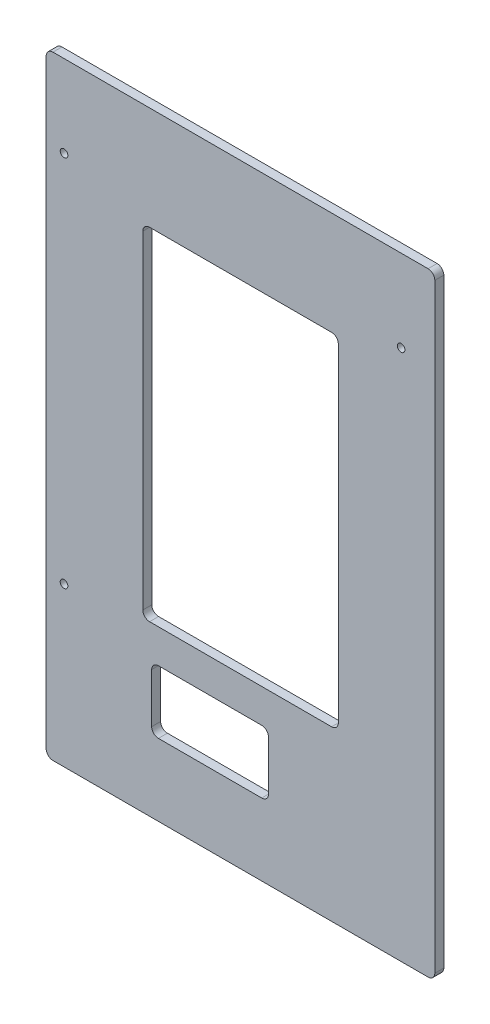
ISO-10303-21;
HEADER;
FILE_DESCRIPTION(('STEP AP214'),'2;1');
FILE_NAME('part.step','',(''),(''),'','','');
FILE_SCHEMA(('AUTOMOTIVE_DESIGN { 1 0 10303 214 1 1 1 1 }'));
ENDSEC;
DATA;
#1=APPLICATION_CONTEXT('core data for automotive mechanical design processes');
#2=APPLICATION_PROTOCOL_DEFINITION('international standard','automotive_design',2000,#1);
#3=PRODUCT_CONTEXT('',#1,'mechanical');
#4=PRODUCT('Part','Part','',(#3));
#5=PRODUCT_RELATED_PRODUCT_CATEGORY('part','',(#4));
#6=PRODUCT_DEFINITION_FORMATION('','',#4);
#7=PRODUCT_DEFINITION_CONTEXT('part definition',#1,'design');
#8=PRODUCT_DEFINITION('design','',#6,#7);
#9=PRODUCT_DEFINITION_SHAPE('','',#8);
#10=(LENGTH_UNIT() NAMED_UNIT(*) SI_UNIT(.MILLI.,.METRE.));
#11=(NAMED_UNIT(*) PLANE_ANGLE_UNIT() SI_UNIT($,.RADIAN.));
#12=(NAMED_UNIT(*) SI_UNIT($,.STERADIAN.) SOLID_ANGLE_UNIT());
#13=UNCERTAINTY_MEASURE_WITH_UNIT(LENGTH_MEASURE(1.E-05),#10,'distance_accuracy_value','');
#14=(GEOMETRIC_REPRESENTATION_CONTEXT(3) GLOBAL_UNCERTAINTY_ASSIGNED_CONTEXT((#13)) GLOBAL_UNIT_ASSIGNED_CONTEXT((#10,
#11,#12)) REPRESENTATION_CONTEXT('',''));
#15=CARTESIAN_POINT('',(0.,0.,0.));
#16=DIRECTION('',(0.,0.,1.));
#17=DIRECTION('',(1.,0.,0.));
#18=AXIS2_PLACEMENT_3D('',#15,#16,#17);
#19=CARTESIAN_POINT('',(0.,0.,4.));
#20=DIRECTION('',(0.,0.,-1.));
#21=DIRECTION('',(-1.,0.,0.));
#22=AXIS2_PLACEMENT_3D('',#19,#20,#21);
#23=PLANE('',#22);
#24=CARTESIAN_POINT('',(7.93,236.5,4.));
#25=DIRECTION('',(0.,0.,1.));
#26=DIRECTION('',(1.,0.,0.));
#27=AXIS2_PLACEMENT_3D('',#24,#25,#26);
#28=CIRCLE('',#27,1.69999999999999);
#29=CARTESIAN_POINT('',(9.62999999999999,236.5,4.));
#30=VERTEX_POINT('',#29);
#31=EDGE_CURVE('E693',#30,#30,#28,.T.);
#32=ORIENTED_EDGE('',*,*,#31,.F.);
#33=EDGE_LOOP('',(#32));
#34=FACE_BOUND('',#33,.T.);
#35=CARTESIAN_POINT('',(7.93,70.5,4.));
#36=DIRECTION('',(0.,0.,1.));
#37=DIRECTION('',(1.,0.,0.));
#38=AXIS2_PLACEMENT_3D('',#35,#36,#37);
#39=CIRCLE('',#38,1.69999999999999);
#40=CARTESIAN_POINT('',(9.62999999999999,70.5,4.));
#41=VERTEX_POINT('',#40);
#42=EDGE_CURVE('E697',#41,#41,#39,.T.);
#43=ORIENTED_EDGE('',*,*,#42,.F.);
#44=EDGE_LOOP('',(#43));
#45=FACE_BOUND('',#44,.T.);
#46=CARTESIAN_POINT('',(157.93,236.5,4.));
#47=DIRECTION('',(0.,0.,1.));
#48=DIRECTION('',(1.,0.,0.));
#49=AXIS2_PLACEMENT_3D('',#46,#47,#48);
#50=CIRCLE('',#49,1.69999999999998);
#51=CARTESIAN_POINT('',(159.63,236.5,4.));
#52=VERTEX_POINT('',#51);
#53=EDGE_CURVE('E707',#52,#52,#50,.T.);
#54=ORIENTED_EDGE('',*,*,#53,.F.);
#55=EDGE_LOOP('',(#54));
#56=FACE_BOUND('',#55,.T.);
#57=DIRECTION('',(0.,-1.,0.));
#58=VECTOR('',#57,1.);
#59=CARTESIAN_POINT('',(43.,75.,4.));
#60=LINE('',#59,#58);
#61=CARTESIAN_POINT('',(43.,224.,4.));
#62=VERTEX_POINT('',#61);
#63=CARTESIAN_POINT('',(43.,78.,4.));
#64=VERTEX_POINT('',#63);
#65=EDGE_CURVE('E405',#62,#64,#60,.T.);
#66=ORIENTED_EDGE('',*,*,#65,.F.);
#67=CARTESIAN_POINT('',(46.,224.,4.));
#68=DIRECTION('',(0.,0.,-1.));
#69=DIRECTION('',(-1.,0.,0.));
#70=AXIS2_PLACEMENT_3D('',#67,#68,#69);
#71=CIRCLE('',#70,3.);
#72=CARTESIAN_POINT('',(46.,227.,4.));
#73=VERTEX_POINT('',#72);
#74=EDGE_CURVE('E11',#62,#73,#71,.T.);
#75=ORIENTED_EDGE('',*,*,#74,.T.);
#76=DIRECTION('',(-1.,0.,0.));
#77=VECTOR('',#76,1.);
#78=CARTESIAN_POINT('',(43.,227.,4.));
#79=LINE('',#78,#77);
#80=CARTESIAN_POINT('',(127.,227.,4.));
#81=VERTEX_POINT('',#80);
#82=EDGE_CURVE('E403',#81,#73,#79,.T.);
#83=ORIENTED_EDGE('',*,*,#82,.F.);
#84=CARTESIAN_POINT('',(127.,224.,4.));
#85=DIRECTION('',(0.,0.,-1.));
#86=DIRECTION('',(-1.,0.,0.));
#87=AXIS2_PLACEMENT_3D('',#84,#85,#86);
#88=CIRCLE('',#87,3.);
#89=CARTESIAN_POINT('',(130.,224.,4.));
#90=VERTEX_POINT('',#89);
#91=EDGE_CURVE('E374',#81,#90,#88,.T.);
#92=ORIENTED_EDGE('',*,*,#91,.T.);
#93=DIRECTION('',(0.,1.,0.));
#94=VECTOR('',#93,1.);
#95=CARTESIAN_POINT('',(130.,75.,4.));
#96=LINE('',#95,#94);
#97=CARTESIAN_POINT('',(130.,78.,4.));
#98=VERTEX_POINT('',#97);
#99=EDGE_CURVE('E411',#98,#90,#96,.T.);
#100=ORIENTED_EDGE('',*,*,#99,.F.);
#101=CARTESIAN_POINT('',(127.,78.,4.));
#102=DIRECTION('',(0.,0.,-1.));
#103=DIRECTION('',(-1.,0.,0.));
#104=AXIS2_PLACEMENT_3D('',#101,#102,#103);
#105=CIRCLE('',#104,3.);
#106=CARTESIAN_POINT('',(127.,75.,4.));
#107=VERTEX_POINT('',#106);
#108=EDGE_CURVE('E368',#98,#107,#105,.T.);
#109=ORIENTED_EDGE('',*,*,#108,.T.);
#110=DIRECTION('',(1.,0.,0.));
#111=VECTOR('',#110,1.);
#112=CARTESIAN_POINT('',(43.,75.,4.));
#113=LINE('',#112,#111);
#114=CARTESIAN_POINT('',(46.,75.,4.));
#115=VERTEX_POINT('',#114);
#116=EDGE_CURVE('E419',#115,#107,#113,.T.);
#117=ORIENTED_EDGE('',*,*,#116,.F.);
#118=CARTESIAN_POINT('',(46.,78.,4.));
#119=DIRECTION('',(0.,0.,-1.));
#120=DIRECTION('',(-1.,0.,0.));
#121=AXIS2_PLACEMENT_3D('',#118,#119,#120);
#122=CIRCLE('',#121,3.);
#123=EDGE_CURVE('E362',#115,#64,#122,.T.);
#124=ORIENTED_EDGE('',*,*,#123,.T.);
#125=EDGE_LOOP('',(#66,#75,#83,#92,#100,#109,#117,#124));
#126=FACE_BOUND('',#125,.T.);
#127=DIRECTION('',(0.,-1.,0.));
#128=VECTOR('',#127,1.);
#129=CARTESIAN_POINT('',(0.,0.,4.));
#130=LINE('',#129,#128);
#131=CARTESIAN_POINT('',(0.,270.,4.));
#132=VERTEX_POINT('',#131);
#133=CARTESIAN_POINT('',(0.,3.,4.));
#134=VERTEX_POINT('',#133);
#135=EDGE_CURVE('E431',#132,#134,#130,.T.);
#136=ORIENTED_EDGE('',*,*,#135,.T.);
#137=CARTESIAN_POINT('',(3.,3.,4.));
#138=DIRECTION('',(0.,0.,-1.));
#139=DIRECTION('',(-1.,0.,0.));
#140=AXIS2_PLACEMENT_3D('',#137,#138,#139);
#141=CIRCLE('',#140,3.);
#142=CARTESIAN_POINT('',(3.,0.,4.));
#143=VERTEX_POINT('',#142);
#144=EDGE_CURVE('E324',#134,#143,#141,.F.);
#145=ORIENTED_EDGE('',*,*,#144,.T.);
#146=DIRECTION('',(1.,0.,0.));
#147=VECTOR('',#146,1.);
#148=CARTESIAN_POINT('',(0.,0.,4.));
#149=LINE('',#148,#147);
#150=CARTESIAN_POINT('',(169.93,0.,4.));
#151=VERTEX_POINT('',#150);
#152=EDGE_CURVE('E435',#143,#151,#149,.T.);
#153=ORIENTED_EDGE('',*,*,#152,.T.);
#154=CARTESIAN_POINT('',(169.93,3.,4.));
#155=DIRECTION('',(0.,0.,-1.));
#156=DIRECTION('',(-1.,0.,0.));
#157=AXIS2_PLACEMENT_3D('',#154,#155,#156);
#158=CIRCLE('',#157,3.);
#159=CARTESIAN_POINT('',(172.93,3.,4.));
#160=VERTEX_POINT('',#159);
#161=EDGE_CURVE('E321',#151,#160,#158,.F.);
#162=ORIENTED_EDGE('',*,*,#161,.T.);
#163=DIRECTION('',(0.,1.,0.));
#164=VECTOR('',#163,1.);
#165=CARTESIAN_POINT('',(172.93,0.,4.));
#166=LINE('',#165,#164);
#167=CARTESIAN_POINT('',(172.93,270.,4.));
#168=VERTEX_POINT('',#167);
#169=EDGE_CURVE('E237',#160,#168,#166,.T.);
#170=ORIENTED_EDGE('',*,*,#169,.T.);
#171=CARTESIAN_POINT('',(169.93,270.,4.));
#172=DIRECTION('',(0.,0.,-1.));
#173=DIRECTION('',(-1.,0.,0.));
#174=AXIS2_PLACEMENT_3D('',#171,#172,#173);
#175=CIRCLE('',#174,3.);
#176=CARTESIAN_POINT('',(169.93,273.,4.));
#177=VERTEX_POINT('',#176);
#178=EDGE_CURVE('E62',#168,#177,#175,.F.);
#179=ORIENTED_EDGE('',*,*,#178,.T.);
#180=DIRECTION('',(-1.,0.,0.));
#181=VECTOR('',#180,1.);
#182=CARTESIAN_POINT('',(0.,273.,4.));
#183=LINE('',#182,#181);
#184=CARTESIAN_POINT('',(3.,273.,4.));
#185=VERTEX_POINT('',#184);
#186=EDGE_CURVE('E231',#177,#185,#183,.T.);
#187=ORIENTED_EDGE('',*,*,#186,.T.);
#188=CARTESIAN_POINT('',(3.,270.,4.));
#189=DIRECTION('',(0.,0.,-1.));
#190=DIRECTION('',(-1.,0.,0.));
#191=AXIS2_PLACEMENT_3D('',#188,#189,#190);
#192=CIRCLE('',#191,3.);
#193=EDGE_CURVE('E316',#185,#132,#192,.F.);
#194=ORIENTED_EDGE('',*,*,#193,.T.);
#195=EDGE_LOOP('',(#136,#145,#153,#162,#170,#179,#187,#194));
#196=FACE_BOUND('',#195,.T.);
#197=DIRECTION('',(0.,-1.,0.));
#198=VECTOR('',#197,1.);
#199=CARTESIAN_POINT('',(46.93,60.,4.));
#200=LINE('',#199,#198);
#201=CARTESIAN_POINT('',(46.93,57.,4.));
#202=VERTEX_POINT('',#201);
#203=CARTESIAN_POINT('',(46.93,35.,4.));
#204=VERTEX_POINT('',#203);
#205=EDGE_CURVE('E715',#202,#204,#200,.T.);
#206=ORIENTED_EDGE('',*,*,#205,.F.);
#207=CARTESIAN_POINT('',(49.93,57.,4.));
#208=DIRECTION('',(0.,0.,-1.));
#209=DIRECTION('',(-1.,0.,0.));
#210=AXIS2_PLACEMENT_3D('',#207,#208,#209);
#211=CIRCLE('',#210,3.);
#212=CARTESIAN_POINT('',(49.93,60.,4.));
#213=VERTEX_POINT('',#212);
#214=EDGE_CURVE('E356',#202,#213,#211,.T.);
#215=ORIENTED_EDGE('',*,*,#214,.T.);
#216=DIRECTION('',(-1.,0.,0.));
#217=VECTOR('',#216,1.);
#218=CARTESIAN_POINT('',(46.93,60.,4.));
#219=LINE('',#218,#217);
#220=CARTESIAN_POINT('',(95.93,60.,4.));
#221=VERTEX_POINT('',#220);
#222=EDGE_CURVE('E396',#221,#213,#219,.T.);
#223=ORIENTED_EDGE('',*,*,#222,.F.);
#224=CARTESIAN_POINT('',(95.93,57.,4.));
#225=DIRECTION('',(0.,0.,-1.));
#226=DIRECTION('',(-1.,0.,0.));
#227=AXIS2_PLACEMENT_3D('',#224,#225,#226);
#228=CIRCLE('',#227,3.);
#229=CARTESIAN_POINT('',(98.93,57.,4.));
#230=VERTEX_POINT('',#229);
#231=EDGE_CURVE('E350',#221,#230,#228,.T.);
#232=ORIENTED_EDGE('',*,*,#231,.T.);
#233=DIRECTION('',(0.,1.,0.));
#234=VECTOR('',#233,1.);
#235=CARTESIAN_POINT('',(98.93,60.,4.));
#236=LINE('',#235,#234);
#237=CARTESIAN_POINT('',(98.93,35.,4.));
#238=VERTEX_POINT('',#237);
#239=EDGE_CURVE('E723',#238,#230,#236,.T.);
#240=ORIENTED_EDGE('',*,*,#239,.F.);
#241=CARTESIAN_POINT('',(95.93,35.,4.));
#242=DIRECTION('',(0.,0.,-1.));
#243=DIRECTION('',(-1.,0.,0.));
#244=AXIS2_PLACEMENT_3D('',#241,#242,#243);
#245=CIRCLE('',#244,3.);
#246=CARTESIAN_POINT('',(95.93,32.,4.));
#247=VERTEX_POINT('',#246);
#248=EDGE_CURVE('E215',#238,#247,#245,.T.);
#249=ORIENTED_EDGE('',*,*,#248,.T.);
#250=DIRECTION('',(1.,0.,0.));
#251=VECTOR('',#250,1.);
#252=CARTESIAN_POINT('',(46.93,32.,4.));
#253=LINE('',#252,#251);
#254=CARTESIAN_POINT('',(49.93,32.,4.));
#255=VERTEX_POINT('',#254);
#256=EDGE_CURVE('E719',#255,#247,#253,.T.);
#257=ORIENTED_EDGE('',*,*,#256,.F.);
#258=CARTESIAN_POINT('',(49.93,35.,4.));
#259=DIRECTION('',(0.,0.,-1.));
#260=DIRECTION('',(-1.,0.,0.));
#261=AXIS2_PLACEMENT_3D('',#258,#259,#260);
#262=CIRCLE('',#261,3.);
#263=EDGE_CURVE('E214',#255,#204,#262,.T.);
#264=ORIENTED_EDGE('',*,*,#263,.T.);
#265=EDGE_LOOP('',(#206,#215,#223,#232,#240,#249,#257,#264));
#266=FACE_BOUND('',#265,.T.);
#267=ADVANCED_FACE('F39',(#34,#45,#56,#126,#196,#266),#23,.F.);
#268=CARTESIAN_POINT('',(0.,0.,0.));
#269=DIRECTION('',(0.,0.,-1.));
#270=DIRECTION('',(-1.,0.,0.));
#271=AXIS2_PLACEMENT_3D('',#268,#269,#270);
#272=PLANE('',#271);
#273=CARTESIAN_POINT('',(7.93,236.5,0.));
#274=DIRECTION('',(0.,0.,1.));
#275=DIRECTION('',(1.,0.,0.));
#276=AXIS2_PLACEMENT_3D('',#273,#274,#275);
#277=CIRCLE('',#276,1.7);
#278=CARTESIAN_POINT('',(9.63,236.5,0.));
#279=VERTEX_POINT('',#278);
#280=EDGE_CURVE('E690',#279,#279,#277,.T.);
#281=ORIENTED_EDGE('',*,*,#280,.T.);
#282=EDGE_LOOP('',(#281));
#283=FACE_BOUND('',#282,.T.);
#284=CARTESIAN_POINT('',(7.93,70.5,0.));
#285=DIRECTION('',(0.,0.,1.));
#286=DIRECTION('',(1.,0.,0.));
#287=AXIS2_PLACEMENT_3D('',#284,#285,#286);
#288=CIRCLE('',#287,1.7);
#289=CARTESIAN_POINT('',(9.63,70.5,0.));
#290=VERTEX_POINT('',#289);
#291=EDGE_CURVE('E703',#290,#290,#288,.T.);
#292=ORIENTED_EDGE('',*,*,#291,.T.);
#293=EDGE_LOOP('',(#292));
#294=FACE_BOUND('',#293,.T.);
#295=CARTESIAN_POINT('',(157.93,236.5,0.));
#296=DIRECTION('',(0.,0.,1.));
#297=DIRECTION('',(1.,0.,0.));
#298=AXIS2_PLACEMENT_3D('',#295,#296,#297);
#299=CIRCLE('',#298,1.70000000000001);
#300=CARTESIAN_POINT('',(159.63,236.5,0.));
#301=VERTEX_POINT('',#300);
#302=EDGE_CURVE('E711',#301,#301,#299,.T.);
#303=ORIENTED_EDGE('',*,*,#302,.T.);
#304=EDGE_LOOP('',(#303));
#305=FACE_BOUND('',#304,.T.);
#306=DIRECTION('',(0.,1.,0.));
#307=VECTOR('',#306,1.);
#308=CARTESIAN_POINT('',(130.,75.,0.));
#309=LINE('',#308,#307);
#310=CARTESIAN_POINT('',(130.,78.,0.));
#311=VERTEX_POINT('',#310);
#312=CARTESIAN_POINT('',(130.,224.,0.));
#313=VERTEX_POINT('',#312);
#314=EDGE_CURVE('E426',#311,#313,#309,.T.);
#315=ORIENTED_EDGE('',*,*,#314,.T.);
#316=CARTESIAN_POINT('',(127.,224.,0.));
#317=DIRECTION('',(0.,0.,-1.));
#318=DIRECTION('',(-1.,0.,0.));
#319=AXIS2_PLACEMENT_3D('',#316,#317,#318);
#320=CIRCLE('',#319,3.);
#321=CARTESIAN_POINT('',(127.,227.,0.));
#322=VERTEX_POINT('',#321);
#323=EDGE_CURVE('E371',#313,#322,#320,.F.);
#324=ORIENTED_EDGE('',*,*,#323,.T.);
#325=DIRECTION('',(-1.,0.,0.));
#326=VECTOR('',#325,1.);
#327=CARTESIAN_POINT('',(43.,227.,0.));
#328=LINE('',#327,#326);
#329=CARTESIAN_POINT('',(46.,227.,0.));
#330=VERTEX_POINT('',#329);
#331=EDGE_CURVE('E385',#322,#330,#328,.T.);
#332=ORIENTED_EDGE('',*,*,#331,.T.);
#333=CARTESIAN_POINT('',(46.,224.,0.));
#334=DIRECTION('',(0.,0.,-1.));
#335=DIRECTION('',(-1.,0.,0.));
#336=AXIS2_PLACEMENT_3D('',#333,#334,#335);
#337=CIRCLE('',#336,3.);
#338=CARTESIAN_POINT('',(43.,224.,0.));
#339=VERTEX_POINT('',#338);
#340=EDGE_CURVE('E48',#330,#339,#337,.F.);
#341=ORIENTED_EDGE('',*,*,#340,.T.);
#342=DIRECTION('',(0.,-1.,0.));
#343=VECTOR('',#342,1.);
#344=CARTESIAN_POINT('',(43.,75.,0.));
#345=LINE('',#344,#343);
#346=CARTESIAN_POINT('',(43.,78.,0.));
#347=VERTEX_POINT('',#346);
#348=EDGE_CURVE('E383',#339,#347,#345,.T.);
#349=ORIENTED_EDGE('',*,*,#348,.T.);
#350=CARTESIAN_POINT('',(46.,78.,0.));
#351=DIRECTION('',(0.,0.,-1.));
#352=DIRECTION('',(-1.,0.,0.));
#353=AXIS2_PLACEMENT_3D('',#350,#351,#352);
#354=CIRCLE('',#353,3.);
#355=CARTESIAN_POINT('',(46.,75.,0.));
#356=VERTEX_POINT('',#355);
#357=EDGE_CURVE('E359',#347,#356,#354,.F.);
#358=ORIENTED_EDGE('',*,*,#357,.T.);
#359=DIRECTION('',(1.,0.,0.));
#360=VECTOR('',#359,1.);
#361=CARTESIAN_POINT('',(43.,75.,0.));
#362=LINE('',#361,#360);
#363=CARTESIAN_POINT('',(127.,75.,0.));
#364=VERTEX_POINT('',#363);
#365=EDGE_CURVE('E395',#356,#364,#362,.T.);
#366=ORIENTED_EDGE('',*,*,#365,.T.);
#367=CARTESIAN_POINT('',(127.,78.,0.));
#368=DIRECTION('',(0.,0.,-1.));
#369=DIRECTION('',(-1.,0.,0.));
#370=AXIS2_PLACEMENT_3D('',#367,#368,#369);
#371=CIRCLE('',#370,3.);
#372=EDGE_CURVE('E365',#364,#311,#371,.F.);
#373=ORIENTED_EDGE('',*,*,#372,.T.);
#374=EDGE_LOOP('',(#315,#324,#332,#341,#349,#358,#366,#373));
#375=FACE_BOUND('',#374,.T.);
#376=DIRECTION('',(1.,0.,0.));
#377=VECTOR('',#376,1.);
#378=CARTESIAN_POINT('',(0.,0.,0.));
#379=LINE('',#378,#377);
#380=CARTESIAN_POINT('',(3.,0.,0.));
#381=VERTEX_POINT('',#380);
#382=CARTESIAN_POINT('',(169.93,0.,0.));
#383=VERTEX_POINT('',#382);
#384=EDGE_CURVE('E416',#381,#383,#379,.T.);
#385=ORIENTED_EDGE('',*,*,#384,.F.);
#386=CARTESIAN_POINT('',(3.,3.,0.));
#387=DIRECTION('',(0.,0.,-1.));
#388=DIRECTION('',(-1.,0.,0.));
#389=AXIS2_PLACEMENT_3D('',#386,#387,#388);
#390=CIRCLE('',#389,3.);
#391=CARTESIAN_POINT('',(0.,3.,0.));
#392=VERTEX_POINT('',#391);
#393=EDGE_CURVE('E306',#381,#392,#390,.T.);
#394=ORIENTED_EDGE('',*,*,#393,.T.);
#395=DIRECTION('',(0.,-1.,0.));
#396=VECTOR('',#395,1.);
#397=CARTESIAN_POINT('',(0.,0.,0.));
#398=LINE('',#397,#396);
#399=CARTESIAN_POINT('',(0.,270.,0.));
#400=VERTEX_POINT('',#399);
#401=EDGE_CURVE('E410',#400,#392,#398,.T.);
#402=ORIENTED_EDGE('',*,*,#401,.F.);
#403=CARTESIAN_POINT('',(3.,270.,0.));
#404=DIRECTION('',(0.,0.,-1.));
#405=DIRECTION('',(-1.,0.,0.));
#406=AXIS2_PLACEMENT_3D('',#403,#404,#405);
#407=CIRCLE('',#406,3.);
#408=CARTESIAN_POINT('',(3.,273.,0.));
#409=VERTEX_POINT('',#408);
#410=EDGE_CURVE('E297',#400,#409,#407,.T.);
#411=ORIENTED_EDGE('',*,*,#410,.T.);
#412=DIRECTION('',(-1.,0.,0.));
#413=VECTOR('',#412,1.);
#414=CARTESIAN_POINT('',(0.,273.,0.));
#415=LINE('',#414,#413);
#416=CARTESIAN_POINT('',(169.93,273.,0.));
#417=VERTEX_POINT('',#416);
#418=EDGE_CURVE('E240',#417,#409,#415,.T.);
#419=ORIENTED_EDGE('',*,*,#418,.F.);
#420=CARTESIAN_POINT('',(169.93,270.,0.));
#421=DIRECTION('',(0.,0.,-1.));
#422=DIRECTION('',(-1.,0.,0.));
#423=AXIS2_PLACEMENT_3D('',#420,#421,#422);
#424=CIRCLE('',#423,3.);
#425=CARTESIAN_POINT('',(172.93,270.,0.));
#426=VERTEX_POINT('',#425);
#427=EDGE_CURVE('E300',#417,#426,#424,.T.);
#428=ORIENTED_EDGE('',*,*,#427,.T.);
#429=DIRECTION('',(0.,1.,0.));
#430=VECTOR('',#429,1.);
#431=CARTESIAN_POINT('',(172.93,0.,0.));
#432=LINE('',#431,#430);
#433=CARTESIAN_POINT('',(172.93,3.,0.));
#434=VERTEX_POINT('',#433);
#435=EDGE_CURVE('E443',#434,#426,#432,.T.);
#436=ORIENTED_EDGE('',*,*,#435,.F.);
#437=CARTESIAN_POINT('',(169.93,3.,0.));
#438=DIRECTION('',(0.,0.,-1.));
#439=DIRECTION('',(-1.,0.,0.));
#440=AXIS2_PLACEMENT_3D('',#437,#438,#439);
#441=CIRCLE('',#440,3.);
#442=EDGE_CURVE('E303',#434,#383,#441,.T.);
#443=ORIENTED_EDGE('',*,*,#442,.T.);
#444=EDGE_LOOP('',(#385,#394,#402,#411,#419,#428,#436,#443));
#445=FACE_BOUND('',#444,.T.);
#446=DIRECTION('',(0.,1.,0.));
#447=VECTOR('',#446,1.);
#448=CARTESIAN_POINT('',(98.93,60.,0.));
#449=LINE('',#448,#447);
#450=CARTESIAN_POINT('',(98.93,35.,0.));
#451=VERTEX_POINT('',#450);
#452=CARTESIAN_POINT('',(98.93,57.,0.));
#453=VERTEX_POINT('',#452);
#454=EDGE_CURVE('E226',#451,#453,#449,.T.);
#455=ORIENTED_EDGE('',*,*,#454,.T.);
#456=CARTESIAN_POINT('',(95.93,57.,0.));
#457=DIRECTION('',(0.,0.,-1.));
#458=DIRECTION('',(-1.,0.,0.));
#459=AXIS2_PLACEMENT_3D('',#456,#457,#458);
#460=CIRCLE('',#459,3.);
#461=CARTESIAN_POINT('',(95.93,60.,0.));
#462=VERTEX_POINT('',#461);
#463=EDGE_CURVE('E347',#453,#462,#460,.F.);
#464=ORIENTED_EDGE('',*,*,#463,.T.);
#465=DIRECTION('',(-1.,0.,0.));
#466=VECTOR('',#465,1.);
#467=CARTESIAN_POINT('',(46.93,60.,0.));
#468=LINE('',#467,#466);
#469=CARTESIAN_POINT('',(49.93,60.,0.));
#470=VERTEX_POINT('',#469);
#471=EDGE_CURVE('E720',#462,#470,#468,.T.);
#472=ORIENTED_EDGE('',*,*,#471,.T.);
#473=CARTESIAN_POINT('',(49.93,57.,0.));
#474=DIRECTION('',(0.,0.,-1.));
#475=DIRECTION('',(-1.,0.,0.));
#476=AXIS2_PLACEMENT_3D('',#473,#474,#475);
#477=CIRCLE('',#476,3.);
#478=CARTESIAN_POINT('',(46.93,57.,0.));
#479=VERTEX_POINT('',#478);
#480=EDGE_CURVE('E353',#470,#479,#477,.F.);
#481=ORIENTED_EDGE('',*,*,#480,.T.);
#482=DIRECTION('',(0.,-1.,0.));
#483=VECTOR('',#482,1.);
#484=CARTESIAN_POINT('',(46.93,60.,0.));
#485=LINE('',#484,#483);
#486=CARTESIAN_POINT('',(46.93,35.,0.));
#487=VERTEX_POINT('',#486);
#488=EDGE_CURVE('E208',#479,#487,#485,.T.);
#489=ORIENTED_EDGE('',*,*,#488,.T.);
#490=CARTESIAN_POINT('',(49.93,35.,0.));
#491=DIRECTION('',(0.,0.,-1.));
#492=DIRECTION('',(-1.,0.,0.));
#493=AXIS2_PLACEMENT_3D('',#490,#491,#492);
#494=CIRCLE('',#493,3.);
#495=CARTESIAN_POINT('',(49.93,32.,0.));
#496=VERTEX_POINT('',#495);
#497=EDGE_CURVE('E202',#487,#496,#494,.F.);
#498=ORIENTED_EDGE('',*,*,#497,.T.);
#499=DIRECTION('',(1.,0.,0.));
#500=VECTOR('',#499,1.);
#501=CARTESIAN_POINT('',(46.93,32.,0.));
#502=LINE('',#501,#500);
#503=CARTESIAN_POINT('',(95.93,32.,0.));
#504=VERTEX_POINT('',#503);
#505=EDGE_CURVE('E206',#496,#504,#502,.T.);
#506=ORIENTED_EDGE('',*,*,#505,.T.);
#507=CARTESIAN_POINT('',(95.93,35.,0.));
#508=DIRECTION('',(0.,0.,-1.));
#509=DIRECTION('',(-1.,0.,0.));
#510=AXIS2_PLACEMENT_3D('',#507,#508,#509);
#511=CIRCLE('',#510,3.);
#512=EDGE_CURVE('E340',#504,#451,#511,.F.);
#513=ORIENTED_EDGE('',*,*,#512,.T.);
#514=EDGE_LOOP('',(#455,#464,#472,#481,#489,#498,#506,#513));
#515=FACE_BOUND('',#514,.T.);
#516=ADVANCED_FACE('F205',(#283,#294,#305,#375,#445,#515),#272,.T.);
#517=CARTESIAN_POINT('',(0.,0.,4.));
#518=DIRECTION('',(1.,0.,0.));
#519=DIRECTION('',(0.,0.,-1.));
#520=AXIS2_PLACEMENT_3D('',#517,#518,#519);
#521=PLANE('',#520);
#522=ORIENTED_EDGE('',*,*,#401,.T.);
#523=DIRECTION('',(0.,0.,-1.));
#524=VECTOR('',#523,1.);
#525=CARTESIAN_POINT('',(0.,3.,4.));
#526=LINE('',#525,#524);
#527=EDGE_CURVE('E313',#392,#134,#526,.F.);
#528=ORIENTED_EDGE('',*,*,#527,.T.);
#529=ORIENTED_EDGE('',*,*,#135,.F.);
#530=DIRECTION('',(0.,0.,-1.));
#531=VECTOR('',#530,1.);
#532=CARTESIAN_POINT('',(0.,270.,4.));
#533=LINE('',#532,#531);
#534=EDGE_CURVE('E309',#132,#400,#533,.T.);
#535=ORIENTED_EDGE('',*,*,#534,.T.);
#536=EDGE_LOOP('',(#522,#528,#529,#535));
#537=FACE_BOUND('',#536,.T.);
#538=ADVANCED_FACE('F460',(#537),#521,.F.);
#539=CARTESIAN_POINT('',(0.,0.,4.));
#540=DIRECTION('',(0.,1.,0.));
#541=DIRECTION('',(0.,0.,1.));
#542=AXIS2_PLACEMENT_3D('',#539,#540,#541);
#543=PLANE('',#542);
#544=ORIENTED_EDGE('',*,*,#152,.F.);
#545=DIRECTION('',(0.,0.,-1.));
#546=VECTOR('',#545,1.);
#547=CARTESIAN_POINT('',(3.,0.,4.));
#548=LINE('',#547,#546);
#549=EDGE_CURVE('E293',#143,#381,#548,.T.);
#550=ORIENTED_EDGE('',*,*,#549,.T.);
#551=ORIENTED_EDGE('',*,*,#384,.T.);
#552=DIRECTION('',(0.,0.,-1.));
#553=VECTOR('',#552,1.);
#554=CARTESIAN_POINT('',(169.93,0.,4.));
#555=LINE('',#554,#553);
#556=EDGE_CURVE('E290',#383,#151,#555,.F.);
#557=ORIENTED_EDGE('',*,*,#556,.T.);
#558=EDGE_LOOP('',(#544,#550,#551,#557));
#559=FACE_BOUND('',#558,.T.);
#560=ADVANCED_FACE('F469',(#559),#543,.F.);
#561=CARTESIAN_POINT('',(172.93,0.,4.));
#562=DIRECTION('',(-1.,0.,0.));
#563=DIRECTION('',(0.,0.,1.));
#564=AXIS2_PLACEMENT_3D('',#561,#562,#563);
#565=PLANE('',#564);
#566=ORIENTED_EDGE('',*,*,#169,.F.);
#567=DIRECTION('',(0.,0.,-1.));
#568=VECTOR('',#567,1.);
#569=CARTESIAN_POINT('',(172.93,3.,4.));
#570=LINE('',#569,#568);
#571=EDGE_CURVE('E330',#160,#434,#570,.T.);
#572=ORIENTED_EDGE('',*,*,#571,.T.);
#573=ORIENTED_EDGE('',*,*,#435,.T.);
#574=DIRECTION('',(0.,0.,-1.));
#575=VECTOR('',#574,1.);
#576=CARTESIAN_POINT('',(172.93,270.,4.));
#577=LINE('',#576,#575);
#578=EDGE_CURVE('E327',#426,#168,#577,.F.);
#579=ORIENTED_EDGE('',*,*,#578,.T.);
#580=EDGE_LOOP('',(#566,#572,#573,#579));
#581=FACE_BOUND('',#580,.T.);
#582=ADVANCED_FACE('F476',(#581),#565,.F.);
#583=CARTESIAN_POINT('',(0.,273.,4.));
#584=DIRECTION('',(0.,-1.,0.));
#585=DIRECTION('',(0.,0.,-1.));
#586=AXIS2_PLACEMENT_3D('',#583,#584,#585);
#587=PLANE('',#586);
#588=ORIENTED_EDGE('',*,*,#186,.F.);
#589=DIRECTION('',(0.,0.,-1.));
#590=VECTOR('',#589,1.);
#591=CARTESIAN_POINT('',(169.93,273.,4.));
#592=LINE('',#591,#590);
#593=EDGE_CURVE('E336',#177,#417,#592,.T.);
#594=ORIENTED_EDGE('',*,*,#593,.T.);
#595=ORIENTED_EDGE('',*,*,#418,.T.);
#596=DIRECTION('',(0.,0.,-1.));
#597=VECTOR('',#596,1.);
#598=CARTESIAN_POINT('',(3.,273.,4.));
#599=LINE('',#598,#597);
#600=EDGE_CURVE('E55',#409,#185,#599,.F.);
#601=ORIENTED_EDGE('',*,*,#600,.T.);
#602=EDGE_LOOP('',(#588,#594,#595,#601));
#603=FACE_BOUND('',#602,.T.);
#604=ADVANCED_FACE('F451',(#603),#587,.F.);
#605=CARTESIAN_POINT('',(43.,75.,4.));
#606=DIRECTION('',(1.,0.,0.));
#607=DIRECTION('',(0.,0.,-1.));
#608=AXIS2_PLACEMENT_3D('',#605,#606,#607);
#609=PLANE('',#608);
#610=ORIENTED_EDGE('',*,*,#65,.T.);
#611=DIRECTION('',(0.,0.,-1.));
#612=VECTOR('',#611,1.);
#613=CARTESIAN_POINT('',(43.,78.,0.));
#614=LINE('',#613,#612);
#615=EDGE_CURVE('E265',#64,#347,#614,.T.);
#616=ORIENTED_EDGE('',*,*,#615,.T.);
#617=ORIENTED_EDGE('',*,*,#348,.F.);
#618=DIRECTION('',(0.,0.,-1.));
#619=VECTOR('',#618,1.);
#620=CARTESIAN_POINT('',(43.,224.,4.));
#621=LINE('',#620,#619);
#622=EDGE_CURVE('E262',#339,#62,#621,.F.);
#623=ORIENTED_EDGE('',*,*,#622,.T.);
#624=EDGE_LOOP('',(#610,#616,#617,#623));
#625=FACE_BOUND('',#624,.T.);
#626=ADVANCED_FACE('F391',(#625),#609,.T.);
#627=CARTESIAN_POINT('',(43.,75.,4.));
#628=DIRECTION('',(0.,1.,0.));
#629=DIRECTION('',(0.,0.,1.));
#630=AXIS2_PLACEMENT_3D('',#627,#628,#629);
#631=PLANE('',#630);
#632=ORIENTED_EDGE('',*,*,#365,.F.);
#633=DIRECTION('',(0.,0.,-1.));
#634=VECTOR('',#633,1.);
#635=CARTESIAN_POINT('',(46.,75.,4.));
#636=LINE('',#635,#634);
#637=EDGE_CURVE('E273',#356,#115,#636,.F.);
#638=ORIENTED_EDGE('',*,*,#637,.T.);
#639=ORIENTED_EDGE('',*,*,#116,.T.);
#640=DIRECTION('',(0.,0.,-1.));
#641=VECTOR('',#640,1.);
#642=CARTESIAN_POINT('',(127.,75.,0.));
#643=LINE('',#642,#641);
#644=EDGE_CURVE('E269',#107,#364,#643,.T.);
#645=ORIENTED_EDGE('',*,*,#644,.T.);
#646=EDGE_LOOP('',(#632,#638,#639,#645));
#647=FACE_BOUND('',#646,.T.);
#648=ADVANCED_FACE('F570',(#647),#631,.T.);
#649=CARTESIAN_POINT('',(130.,75.,4.));
#650=DIRECTION('',(-1.,0.,0.));
#651=DIRECTION('',(0.,0.,1.));
#652=AXIS2_PLACEMENT_3D('',#649,#650,#651);
#653=PLANE('',#652);
#654=ORIENTED_EDGE('',*,*,#314,.F.);
#655=DIRECTION('',(0.,0.,-1.));
#656=VECTOR('',#655,1.);
#657=CARTESIAN_POINT('',(130.,78.,4.));
#658=LINE('',#657,#656);
#659=EDGE_CURVE('E280',#311,#98,#658,.F.);
#660=ORIENTED_EDGE('',*,*,#659,.T.);
#661=ORIENTED_EDGE('',*,*,#99,.T.);
#662=DIRECTION('',(0.,0.,-1.));
#663=VECTOR('',#662,1.);
#664=CARTESIAN_POINT('',(130.,224.,0.));
#665=LINE('',#664,#663);
#666=EDGE_CURVE('E276',#90,#313,#665,.T.);
#667=ORIENTED_EDGE('',*,*,#666,.T.);
#668=EDGE_LOOP('',(#654,#660,#661,#667));
#669=FACE_BOUND('',#668,.T.);
#670=ADVANCED_FACE('F567',(#669),#653,.T.);
#671=CARTESIAN_POINT('',(43.,227.,4.));
#672=DIRECTION('',(0.,-1.,0.));
#673=DIRECTION('',(0.,0.,-1.));
#674=AXIS2_PLACEMENT_3D('',#671,#672,#673);
#675=PLANE('',#674);
#676=ORIENTED_EDGE('',*,*,#331,.F.);
#677=DIRECTION('',(0.,0.,-1.));
#678=VECTOR('',#677,1.);
#679=CARTESIAN_POINT('',(127.,227.,4.));
#680=LINE('',#679,#678);
#681=EDGE_CURVE('E287',#322,#81,#680,.F.);
#682=ORIENTED_EDGE('',*,*,#681,.T.);
#683=ORIENTED_EDGE('',*,*,#82,.T.);
#684=DIRECTION('',(0.,0.,-1.));
#685=VECTOR('',#684,1.);
#686=CARTESIAN_POINT('',(46.,227.,0.));
#687=LINE('',#686,#685);
#688=EDGE_CURVE('E283',#73,#330,#687,.T.);
#689=ORIENTED_EDGE('',*,*,#688,.T.);
#690=EDGE_LOOP('',(#676,#682,#683,#689));
#691=FACE_BOUND('',#690,.T.);
#692=ADVANCED_FACE('F407',(#691),#675,.T.);
#693=CARTESIAN_POINT('',(46.93,60.,4.));
#694=DIRECTION('',(1.,0.,0.));
#695=DIRECTION('',(0.,1.,0.));
#696=AXIS2_PLACEMENT_3D('',#693,#694,#695);
#697=PLANE('',#696);
#698=ORIENTED_EDGE('',*,*,#205,.T.);
#699=DIRECTION('',(0.,0.,-1.));
#700=VECTOR('',#699,1.);
#701=CARTESIAN_POINT('',(46.93,35.,0.));
#702=LINE('',#701,#700);
#703=EDGE_CURVE('E252',#204,#487,#702,.T.);
#704=ORIENTED_EDGE('',*,*,#703,.T.);
#705=ORIENTED_EDGE('',*,*,#488,.F.);
#706=DIRECTION('',(0.,0.,-1.));
#707=VECTOR('',#706,1.);
#708=CARTESIAN_POINT('',(46.93,57.,4.));
#709=LINE('',#708,#707);
#710=EDGE_CURVE('E249',#479,#202,#709,.F.);
#711=ORIENTED_EDGE('',*,*,#710,.T.);
#712=EDGE_LOOP('',(#698,#704,#705,#711));
#713=FACE_BOUND('',#712,.T.);
#714=ADVANCED_FACE('F561',(#713),#697,.T.);
#715=CARTESIAN_POINT('',(46.93,32.,4.));
#716=DIRECTION('',(0.,1.,0.));
#717=DIRECTION('',(0.,0.,1.));
#718=AXIS2_PLACEMENT_3D('',#715,#716,#717);
#719=PLANE('',#718);
#720=ORIENTED_EDGE('',*,*,#256,.T.);
#721=DIRECTION('',(0.,0.,-1.));
#722=VECTOR('',#721,1.);
#723=CARTESIAN_POINT('',(95.93,32.,0.));
#724=LINE('',#723,#722);
#725=EDGE_CURVE('E224',#247,#504,#724,.T.);
#726=ORIENTED_EDGE('',*,*,#725,.T.);
#727=ORIENTED_EDGE('',*,*,#505,.F.);
#728=DIRECTION('',(0.,0.,-1.));
#729=VECTOR('',#728,1.);
#730=CARTESIAN_POINT('',(49.93,32.,4.));
#731=LINE('',#730,#729);
#732=EDGE_CURVE('E221',#496,#255,#731,.F.);
#733=ORIENTED_EDGE('',*,*,#732,.T.);
#734=EDGE_LOOP('',(#720,#726,#727,#733));
#735=FACE_BOUND('',#734,.T.);
#736=ADVANCED_FACE('F220',(#735),#719,.T.);
#737=CARTESIAN_POINT('',(98.93,60.,4.));
#738=DIRECTION('',(-1.,0.,0.));
#739=DIRECTION('',(0.,0.,1.));
#740=AXIS2_PLACEMENT_3D('',#737,#738,#739);
#741=PLANE('',#740);
#742=ORIENTED_EDGE('',*,*,#454,.F.);
#743=DIRECTION('',(0.,0.,-1.));
#744=VECTOR('',#743,1.);
#745=CARTESIAN_POINT('',(98.93,35.,4.));
#746=LINE('',#745,#744);
#747=EDGE_CURVE('E246',#451,#238,#746,.F.);
#748=ORIENTED_EDGE('',*,*,#747,.T.);
#749=ORIENTED_EDGE('',*,*,#239,.T.);
#750=DIRECTION('',(0.,0.,-1.));
#751=VECTOR('',#750,1.);
#752=CARTESIAN_POINT('',(98.93,57.,0.));
#753=LINE('',#752,#751);
#754=EDGE_CURVE('E235',#230,#453,#753,.T.);
#755=ORIENTED_EDGE('',*,*,#754,.T.);
#756=EDGE_LOOP('',(#742,#748,#749,#755));
#757=FACE_BOUND('',#756,.T.);
#758=ADVANCED_FACE('F554',(#757),#741,.T.);
#759=CARTESIAN_POINT('',(46.93,60.,4.));
#760=DIRECTION('',(0.,-1.,0.));
#761=DIRECTION('',(0.,0.,-1.));
#762=AXIS2_PLACEMENT_3D('',#759,#760,#761);
#763=PLANE('',#762);
#764=ORIENTED_EDGE('',*,*,#471,.F.);
#765=DIRECTION('',(0.,0.,-1.));
#766=VECTOR('',#765,1.);
#767=CARTESIAN_POINT('',(95.93,60.,4.));
#768=LINE('',#767,#766);
#769=EDGE_CURVE('E259',#462,#221,#768,.F.);
#770=ORIENTED_EDGE('',*,*,#769,.T.);
#771=ORIENTED_EDGE('',*,*,#222,.T.);
#772=DIRECTION('',(0.,0.,-1.));
#773=VECTOR('',#772,1.);
#774=CARTESIAN_POINT('',(49.93,60.,0.));
#775=LINE('',#774,#773);
#776=EDGE_CURVE('E255',#213,#470,#775,.T.);
#777=ORIENTED_EDGE('',*,*,#776,.T.);
#778=EDGE_LOOP('',(#764,#770,#771,#777));
#779=FACE_BOUND('',#778,.T.);
#780=ADVANCED_FACE('F502',(#779),#763,.T.);
#781=CARTESIAN_POINT('',(95.93,35.,4.));
#782=DIRECTION('',(0.,0.,1.));
#783=DIRECTION('',(1.,0.,0.));
#784=AXIS2_PLACEMENT_3D('',#781,#782,#783);
#785=CYLINDRICAL_SURFACE('',#784,3.);
#786=ORIENTED_EDGE('',*,*,#248,.F.);
#787=ORIENTED_EDGE('',*,*,#747,.F.);
#788=ORIENTED_EDGE('',*,*,#512,.F.);
#789=ORIENTED_EDGE('',*,*,#725,.F.);
#790=EDGE_LOOP('',(#786,#787,#788,#789));
#791=FACE_BOUND('',#790,.T.);
#792=ADVANCED_FACE('F499',(#791),#785,.F.);
#793=CARTESIAN_POINT('',(49.93,35.,4.));
#794=DIRECTION('',(0.,0.,1.));
#795=DIRECTION('',(1.,0.,0.));
#796=AXIS2_PLACEMENT_3D('',#793,#794,#795);
#797=CYLINDRICAL_SURFACE('',#796,3.);
#798=ORIENTED_EDGE('',*,*,#263,.F.);
#799=ORIENTED_EDGE('',*,*,#732,.F.);
#800=ORIENTED_EDGE('',*,*,#497,.F.);
#801=ORIENTED_EDGE('',*,*,#703,.F.);
#802=EDGE_LOOP('',(#798,#799,#800,#801));
#803=FACE_BOUND('',#802,.T.);
#804=ADVANCED_FACE('F229',(#803),#797,.F.);
#805=CARTESIAN_POINT('',(95.93,57.,4.));
#806=DIRECTION('',(0.,0.,1.));
#807=DIRECTION('',(1.,0.,0.));
#808=AXIS2_PLACEMENT_3D('',#805,#806,#807);
#809=CYLINDRICAL_SURFACE('',#808,3.);
#810=ORIENTED_EDGE('',*,*,#231,.F.);
#811=ORIENTED_EDGE('',*,*,#769,.F.);
#812=ORIENTED_EDGE('',*,*,#463,.F.);
#813=ORIENTED_EDGE('',*,*,#754,.F.);
#814=EDGE_LOOP('',(#810,#811,#812,#813));
#815=FACE_BOUND('',#814,.T.);
#816=ADVANCED_FACE('F506',(#815),#809,.F.);
#817=CARTESIAN_POINT('',(49.93,57.,4.));
#818=DIRECTION('',(0.,0.,1.));
#819=DIRECTION('',(1.,0.,0.));
#820=AXIS2_PLACEMENT_3D('',#817,#818,#819);
#821=CYLINDRICAL_SURFACE('',#820,3.);
#822=ORIENTED_EDGE('',*,*,#214,.F.);
#823=ORIENTED_EDGE('',*,*,#710,.F.);
#824=ORIENTED_EDGE('',*,*,#480,.F.);
#825=ORIENTED_EDGE('',*,*,#776,.F.);
#826=EDGE_LOOP('',(#822,#823,#824,#825));
#827=FACE_BOUND('',#826,.T.);
#828=ADVANCED_FACE('F509',(#827),#821,.F.);
#829=CARTESIAN_POINT('',(46.,78.,4.));
#830=DIRECTION('',(0.,0.,1.));
#831=DIRECTION('',(1.,0.,0.));
#832=AXIS2_PLACEMENT_3D('',#829,#830,#831);
#833=CYLINDRICAL_SURFACE('',#832,3.);
#834=ORIENTED_EDGE('',*,*,#123,.F.);
#835=ORIENTED_EDGE('',*,*,#637,.F.);
#836=ORIENTED_EDGE('',*,*,#357,.F.);
#837=ORIENTED_EDGE('',*,*,#615,.F.);
#838=EDGE_LOOP('',(#834,#835,#836,#837));
#839=FACE_BOUND('',#838,.T.);
#840=ADVANCED_FACE('F513',(#839),#833,.F.);
#841=CARTESIAN_POINT('',(127.,78.,4.));
#842=DIRECTION('',(0.,0.,1.));
#843=DIRECTION('',(1.,0.,0.));
#844=AXIS2_PLACEMENT_3D('',#841,#842,#843);
#845=CYLINDRICAL_SURFACE('',#844,3.);
#846=ORIENTED_EDGE('',*,*,#108,.F.);
#847=ORIENTED_EDGE('',*,*,#659,.F.);
#848=ORIENTED_EDGE('',*,*,#372,.F.);
#849=ORIENTED_EDGE('',*,*,#644,.F.);
#850=EDGE_LOOP('',(#846,#847,#848,#849));
#851=FACE_BOUND('',#850,.T.);
#852=ADVANCED_FACE('F517',(#851),#845,.F.);
#853=CARTESIAN_POINT('',(127.,224.,4.));
#854=DIRECTION('',(0.,0.,1.));
#855=DIRECTION('',(1.,0.,0.));
#856=AXIS2_PLACEMENT_3D('',#853,#854,#855);
#857=CYLINDRICAL_SURFACE('',#856,3.);
#858=ORIENTED_EDGE('',*,*,#91,.F.);
#859=ORIENTED_EDGE('',*,*,#681,.F.);
#860=ORIENTED_EDGE('',*,*,#323,.F.);
#861=ORIENTED_EDGE('',*,*,#666,.F.);
#862=EDGE_LOOP('',(#858,#859,#860,#861));
#863=FACE_BOUND('',#862,.T.);
#864=ADVANCED_FACE('F521',(#863),#857,.F.);
#865=CARTESIAN_POINT('',(46.,224.,4.));
#866=DIRECTION('',(0.,0.,1.));
#867=DIRECTION('',(1.,0.,0.));
#868=AXIS2_PLACEMENT_3D('',#865,#866,#867);
#869=CYLINDRICAL_SURFACE('',#868,3.);
#870=ORIENTED_EDGE('',*,*,#74,.F.);
#871=ORIENTED_EDGE('',*,*,#622,.F.);
#872=ORIENTED_EDGE('',*,*,#340,.F.);
#873=ORIENTED_EDGE('',*,*,#688,.F.);
#874=EDGE_LOOP('',(#870,#871,#872,#873));
#875=FACE_BOUND('',#874,.T.);
#876=ADVANCED_FACE('F399',(#875),#869,.F.);
#877=CARTESIAN_POINT('',(3.,3.,4.));
#878=DIRECTION('',(0.,0.,-1.));
#879=DIRECTION('',(-1.,0.,0.));
#880=AXIS2_PLACEMENT_3D('',#877,#878,#879);
#881=CYLINDRICAL_SURFACE('',#880,3.);
#882=ORIENTED_EDGE('',*,*,#144,.F.);
#883=ORIENTED_EDGE('',*,*,#527,.F.);
#884=ORIENTED_EDGE('',*,*,#393,.F.);
#885=ORIENTED_EDGE('',*,*,#549,.F.);
#886=EDGE_LOOP('',(#882,#883,#884,#885));
#887=FACE_BOUND('',#886,.T.);
#888=ADVANCED_FACE('F464',(#887),#881,.T.);
#889=CARTESIAN_POINT('',(169.93,3.,4.));
#890=DIRECTION('',(0.,0.,-1.));
#891=DIRECTION('',(-1.,0.,0.));
#892=AXIS2_PLACEMENT_3D('',#889,#890,#891);
#893=CYLINDRICAL_SURFACE('',#892,3.);
#894=ORIENTED_EDGE('',*,*,#161,.F.);
#895=ORIENTED_EDGE('',*,*,#556,.F.);
#896=ORIENTED_EDGE('',*,*,#442,.F.);
#897=ORIENTED_EDGE('',*,*,#571,.F.);
#898=EDGE_LOOP('',(#894,#895,#896,#897));
#899=FACE_BOUND('',#898,.T.);
#900=ADVANCED_FACE('F473',(#899),#893,.T.);
#901=CARTESIAN_POINT('',(169.93,270.,4.));
#902=DIRECTION('',(0.,0.,-1.));
#903=DIRECTION('',(-1.,0.,0.));
#904=AXIS2_PLACEMENT_3D('',#901,#902,#903);
#905=CYLINDRICAL_SURFACE('',#904,3.);
#906=ORIENTED_EDGE('',*,*,#178,.F.);
#907=ORIENTED_EDGE('',*,*,#578,.F.);
#908=ORIENTED_EDGE('',*,*,#427,.F.);
#909=ORIENTED_EDGE('',*,*,#593,.F.);
#910=EDGE_LOOP('',(#906,#907,#908,#909));
#911=FACE_BOUND('',#910,.T.);
#912=ADVANCED_FACE('F478',(#911),#905,.T.);
#913=CARTESIAN_POINT('',(3.,270.,4.));
#914=DIRECTION('',(0.,0.,-1.));
#915=DIRECTION('',(-1.,0.,0.));
#916=AXIS2_PLACEMENT_3D('',#913,#914,#915);
#917=CYLINDRICAL_SURFACE('',#916,3.);
#918=ORIENTED_EDGE('',*,*,#193,.F.);
#919=ORIENTED_EDGE('',*,*,#600,.F.);
#920=ORIENTED_EDGE('',*,*,#410,.F.);
#921=ORIENTED_EDGE('',*,*,#534,.F.);
#922=EDGE_LOOP('',(#918,#919,#920,#921));
#923=FACE_BOUND('',#922,.T.);
#924=ADVANCED_FACE('F41',(#923),#917,.T.);
#925=CARTESIAN_POINT('',(157.93,236.5,4.));
#926=DIRECTION('',(0.,0.,1.));
#927=DIRECTION('',(1.,0.,0.));
#928=AXIS2_PLACEMENT_3D('',#925,#926,#927);
#929=CYLINDRICAL_SURFACE('',#928,1.69999999999999);
#930=ORIENTED_EDGE('',*,*,#302,.F.);
#931=EDGE_LOOP('',(#930));
#932=FACE_BOUND('',#931,.T.);
#933=ORIENTED_EDGE('',*,*,#53,.T.);
#934=EDGE_LOOP('',(#933));
#935=FACE_BOUND('',#934,.T.);
#936=ADVANCED_FACE('F535',(#932,#935),#929,.F.);
#937=CARTESIAN_POINT('',(7.93,70.5,4.));
#938=DIRECTION('',(0.,0.,1.));
#939=DIRECTION('',(1.,0.,0.));
#940=AXIS2_PLACEMENT_3D('',#937,#938,#939);
#941=CYLINDRICAL_SURFACE('',#940,1.69999999999999);
#942=ORIENTED_EDGE('',*,*,#291,.F.);
#943=EDGE_LOOP('',(#942));
#944=FACE_BOUND('',#943,.T.);
#945=ORIENTED_EDGE('',*,*,#42,.T.);
#946=EDGE_LOOP('',(#945));
#947=FACE_BOUND('',#946,.T.);
#948=ADVANCED_FACE('F539',(#944,#947),#941,.F.);
#949=CARTESIAN_POINT('',(7.93,236.5,4.));
#950=DIRECTION('',(0.,0.,1.));
#951=DIRECTION('',(1.,0.,0.));
#952=AXIS2_PLACEMENT_3D('',#949,#950,#951);
#953=CYLINDRICAL_SURFACE('',#952,1.69999999999999);
#954=ORIENTED_EDGE('',*,*,#280,.F.);
#955=EDGE_LOOP('',(#954));
#956=FACE_BOUND('',#955,.T.);
#957=ORIENTED_EDGE('',*,*,#31,.T.);
#958=EDGE_LOOP('',(#957));
#959=FACE_BOUND('',#958,.T.);
#960=ADVANCED_FACE('F545',(#956,#959),#953,.F.);
#961=CLOSED_SHELL('',(#267,#516,#538,#560,#582,#604,#626,#648,#670,#692,#714,#736,#758,#780,
#792,#804,#816,#828,#840,#852,#864,#876,#888,#900,#912,#924,#936,#948,#960));
#962=MANIFOLD_SOLID_BREP('B2',#961);
#963=ADVANCED_BREP_SHAPE_REPRESENTATION('',(#18,#962),#14);
#964=SHAPE_DEFINITION_REPRESENTATION(#9,#963);
ENDSEC;
END-ISO-10303-21;
